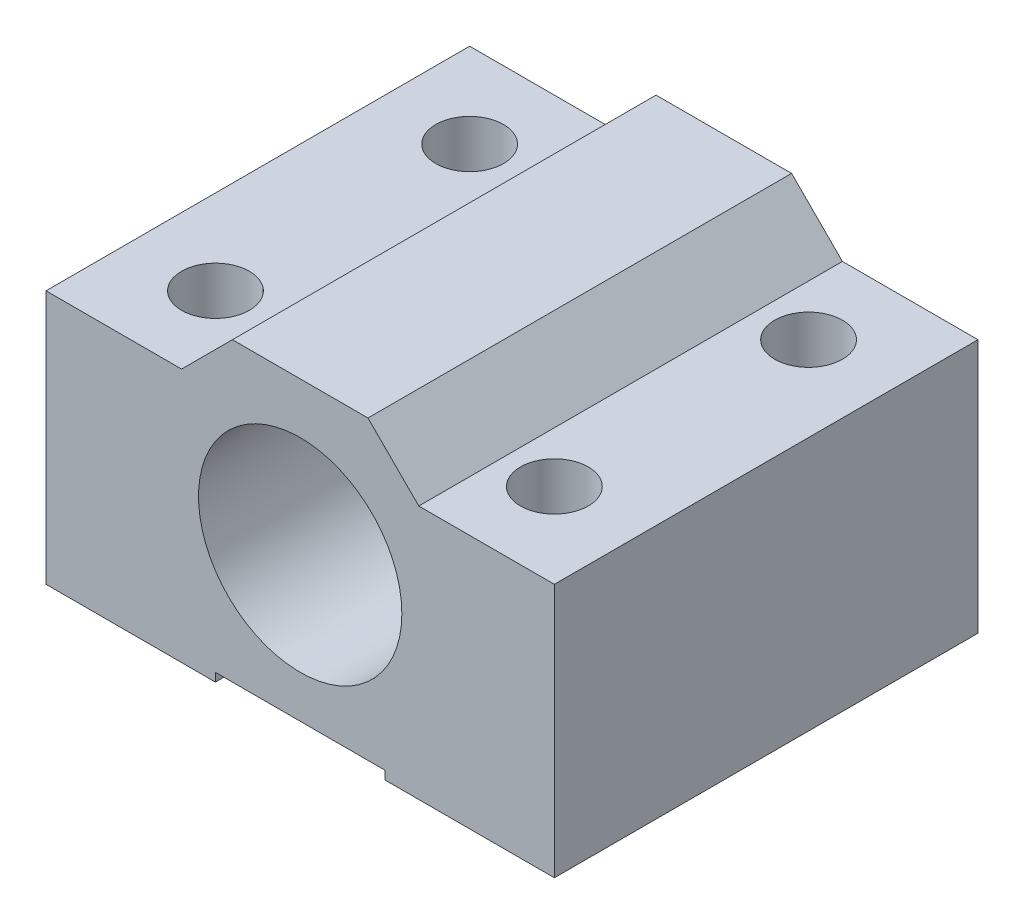
ISO-10303-21;
HEADER;
FILE_DESCRIPTION(('STEP AP214'),'2;1');
FILE_NAME('part.step','',(''),(''),'','','');
FILE_SCHEMA(('AUTOMOTIVE_DESIGN { 1 0 10303 214 1 1 1 1 }'));
ENDSEC;
DATA;
#1=APPLICATION_CONTEXT('core data for automotive mechanical design processes');
#2=APPLICATION_PROTOCOL_DEFINITION('international standard','automotive_design',2000,#1);
#3=PRODUCT_CONTEXT('',#1,'mechanical');
#4=PRODUCT('Part','Part','',(#3));
#5=PRODUCT_RELATED_PRODUCT_CATEGORY('part','',(#4));
#6=PRODUCT_DEFINITION_FORMATION('','',#4);
#7=PRODUCT_DEFINITION_CONTEXT('part definition',#1,'design');
#8=PRODUCT_DEFINITION('design','',#6,#7);
#9=PRODUCT_DEFINITION_SHAPE('','',#8);
#10=(LENGTH_UNIT() NAMED_UNIT(*) SI_UNIT(.MILLI.,.METRE.));
#11=(NAMED_UNIT(*) PLANE_ANGLE_UNIT() SI_UNIT($,.RADIAN.));
#12=(NAMED_UNIT(*) SI_UNIT($,.STERADIAN.) SOLID_ANGLE_UNIT());
#13=UNCERTAINTY_MEASURE_WITH_UNIT(LENGTH_MEASURE(1.E-05),#10,'distance_accuracy_value','');
#14=(GEOMETRIC_REPRESENTATION_CONTEXT(3) GLOBAL_UNCERTAINTY_ASSIGNED_CONTEXT((#13)) GLOBAL_UNIT_ASSIGNED_CONTEXT((#10,
#11,#12)) REPRESENTATION_CONTEXT('',''));
#15=CARTESIAN_POINT('',(0.,0.,0.));
#16=DIRECTION('',(0.,0.,1.));
#17=DIRECTION('',(1.,0.,0.));
#18=AXIS2_PLACEMENT_3D('',#15,#16,#17);
#19=CARTESIAN_POINT('',(15.,0.,25.));
#20=DIRECTION('',(0.,1.,0.));
#21=DIRECTION('',(0.,0.,1.));
#22=AXIS2_PLACEMENT_3D('',#19,#20,#21);
#23=PLANE('',#22);
#24=CARTESIAN_POINT('',(-10.,0.,5.));
#25=DIRECTION('',(0.,1.,0.));
#26=DIRECTION('',(-1.,0.,0.));
#27=AXIS2_PLACEMENT_3D('',#24,#25,#26);
#28=CIRCLE('',#27,2.);
#29=CARTESIAN_POINT('',(-12.,0.,5.));
#30=VERTEX_POINT('',#29);
#31=EDGE_CURVE('E222',#30,#30,#28,.T.);
#32=ORIENTED_EDGE('',*,*,#31,.T.);
#33=EDGE_LOOP('',(#32));
#34=FACE_BOUND('',#33,.T.);
#35=CARTESIAN_POINT('',(-10.,0.,20.));
#36=DIRECTION('',(0.,1.,0.));
#37=DIRECTION('',(1.,0.,0.));
#38=AXIS2_PLACEMENT_3D('',#35,#36,#37);
#39=CIRCLE('',#38,2.);
#40=CARTESIAN_POINT('',(-8.,0.,20.));
#41=VERTEX_POINT('',#40);
#42=EDGE_CURVE('E202',#41,#41,#39,.T.);
#43=ORIENTED_EDGE('',*,*,#42,.T.);
#44=EDGE_LOOP('',(#43));
#45=FACE_BOUND('',#44,.T.);
#46=DIRECTION('',(1.,0.,0.));
#47=VECTOR('',#46,1.);
#48=CARTESIAN_POINT('',(15.,0.,0.));
#49=LINE('',#48,#47);
#50=CARTESIAN_POINT('',(-15.,0.,0.));
#51=VERTEX_POINT('',#50);
#52=CARTESIAN_POINT('',(-5.,0.,0.));
#53=VERTEX_POINT('',#52);
#54=EDGE_CURVE('E152',#51,#53,#49,.T.);
#55=ORIENTED_EDGE('',*,*,#54,.T.);
#56=DIRECTION('',(0.,0.,-1.));
#57=VECTOR('',#56,1.);
#58=CARTESIAN_POINT('',(-5.,0.,25.));
#59=LINE('',#58,#57);
#60=CARTESIAN_POINT('',(-5.,0.,25.));
#61=VERTEX_POINT('',#60);
#62=EDGE_CURVE('E274',#61,#53,#59,.T.);
#63=ORIENTED_EDGE('',*,*,#62,.F.);
#64=DIRECTION('',(1.,0.,0.));
#65=VECTOR('',#64,1.);
#66=CARTESIAN_POINT('',(15.,0.,25.));
#67=LINE('',#66,#65);
#68=CARTESIAN_POINT('',(-15.,0.,25.));
#69=VERTEX_POINT('',#68);
#70=EDGE_CURVE('E179',#69,#61,#67,.T.);
#71=ORIENTED_EDGE('',*,*,#70,.F.);
#72=DIRECTION('',(0.,0.,-1.));
#73=VECTOR('',#72,1.);
#74=CARTESIAN_POINT('',(-15.,0.,25.));
#75=LINE('',#74,#73);
#76=EDGE_CURVE('E42',#69,#51,#75,.T.);
#77=ORIENTED_EDGE('',*,*,#76,.T.);
#78=EDGE_LOOP('',(#55,#63,#71,#77));
#79=FACE_BOUND('',#78,.T.);
#80=ADVANCED_FACE('F34',(#34,#45,#79),#23,.F.);
#81=CARTESIAN_POINT('',(-15.,15.,25.));
#82=DIRECTION('',(0.,-1.,0.));
#83=DIRECTION('',(1.,0.,0.));
#84=AXIS2_PLACEMENT_3D('',#81,#82,#83);
#85=PLANE('',#84);
#86=CARTESIAN_POINT('',(-10.,15.,20.));
#87=DIRECTION('',(0.,1.,0.));
#88=DIRECTION('',(1.,0.,0.));
#89=AXIS2_PLACEMENT_3D('',#86,#87,#88);
#90=CIRCLE('',#89,2.);
#91=CARTESIAN_POINT('',(-8.,15.,20.));
#92=VERTEX_POINT('',#91);
#93=EDGE_CURVE('E206',#92,#92,#90,.T.);
#94=ORIENTED_EDGE('',*,*,#93,.F.);
#95=EDGE_LOOP('',(#94));
#96=FACE_BOUND('',#95,.T.);
#97=CARTESIAN_POINT('',(-9.99999999999999,15.,5.));
#98=DIRECTION('',(0.,1.,0.));
#99=DIRECTION('',(-1.,0.,0.));
#100=AXIS2_PLACEMENT_3D('',#97,#98,#99);
#101=CIRCLE('',#100,2.);
#102=CARTESIAN_POINT('',(-12.,15.,5.));
#103=VERTEX_POINT('',#102);
#104=EDGE_CURVE('E219',#103,#103,#101,.T.);
#105=ORIENTED_EDGE('',*,*,#104,.F.);
#106=EDGE_LOOP('',(#105));
#107=FACE_BOUND('',#106,.T.);
#108=DIRECTION('',(-1.,0.,0.));
#109=VECTOR('',#108,1.);
#110=CARTESIAN_POINT('',(-15.,15.,0.));
#111=LINE('',#110,#109);
#112=CARTESIAN_POINT('',(-6.99999999999999,15.,0.));
#113=VERTEX_POINT('',#112);
#114=CARTESIAN_POINT('',(-15.,15.,0.));
#115=VERTEX_POINT('',#114);
#116=EDGE_CURVE('E145',#113,#115,#111,.T.);
#117=ORIENTED_EDGE('',*,*,#116,.T.);
#118=DIRECTION('',(0.,0.,-1.));
#119=VECTOR('',#118,1.);
#120=CARTESIAN_POINT('',(-15.,15.,25.));
#121=LINE('',#120,#119);
#122=CARTESIAN_POINT('',(-15.,15.,25.));
#123=VERTEX_POINT('',#122);
#124=EDGE_CURVE('E11',#123,#115,#121,.T.);
#125=ORIENTED_EDGE('',*,*,#124,.F.);
#126=DIRECTION('',(-1.,0.,0.));
#127=VECTOR('',#126,1.);
#128=CARTESIAN_POINT('',(-15.,15.,25.));
#129=LINE('',#128,#127);
#130=CARTESIAN_POINT('',(-6.99999999999999,15.,25.));
#131=VERTEX_POINT('',#130);
#132=EDGE_CURVE('E163',#131,#123,#129,.T.);
#133=ORIENTED_EDGE('',*,*,#132,.F.);
#134=DIRECTION('',(0.,0.,-1.));
#135=VECTOR('',#134,1.);
#136=CARTESIAN_POINT('',(-6.99999999999999,15.,25.));
#137=LINE('',#136,#135);
#138=EDGE_CURVE('E141',#131,#113,#137,.T.);
#139=ORIENTED_EDGE('',*,*,#138,.T.);
#140=EDGE_LOOP('',(#117,#125,#133,#139));
#141=FACE_BOUND('',#140,.T.);
#142=ADVANCED_FACE('F36',(#96,#107,#141),#85,.F.);
#143=CARTESIAN_POINT('',(-15.,0.,25.));
#144=DIRECTION('',(1.,0.,0.));
#145=DIRECTION('',(0.,0.,-1.));
#146=AXIS2_PLACEMENT_3D('',#143,#144,#145);
#147=PLANE('',#146);
#148=DIRECTION('',(0.,-1.,0.));
#149=VECTOR('',#148,1.);
#150=CARTESIAN_POINT('',(-15.,0.,0.));
#151=LINE('',#150,#149);
#152=EDGE_CURVE('E148',#115,#51,#151,.T.);
#153=ORIENTED_EDGE('',*,*,#152,.T.);
#154=ORIENTED_EDGE('',*,*,#76,.F.);
#155=DIRECTION('',(0.,-1.,0.));
#156=VECTOR('',#155,1.);
#157=CARTESIAN_POINT('',(-15.,0.,25.));
#158=LINE('',#157,#156);
#159=EDGE_CURVE('E99',#123,#69,#158,.T.);
#160=ORIENTED_EDGE('',*,*,#159,.F.);
#161=ORIENTED_EDGE('',*,*,#124,.T.);
#162=EDGE_LOOP('',(#153,#154,#160,#161));
#163=FACE_BOUND('',#162,.T.);
#164=ADVANCED_FACE('F299',(#163),#147,.F.);
#165=CARTESIAN_POINT('',(9.99999999999998,0.,20.));
#166=DIRECTION('',(0.,1.,0.));
#167=DIRECTION('',(-1.,0.,0.));
#168=AXIS2_PLACEMENT_3D('',#165,#166,#167);
#169=CIRCLE('',#168,2.);
#170=CARTESIAN_POINT('',(7.99999999999998,0.,20.));
#171=VERTEX_POINT('',#170);
#172=EDGE_CURVE('E210',#171,#171,#169,.T.);
#173=ORIENTED_EDGE('',*,*,#172,.T.);
#174=EDGE_LOOP('',(#173));
#175=FACE_BOUND('',#174,.T.);
#176=CARTESIAN_POINT('',(9.99999999999999,0.,5.));
#177=DIRECTION('',(0.,1.,0.));
#178=DIRECTION('',(1.,0.,0.));
#179=AXIS2_PLACEMENT_3D('',#176,#177,#178);
#180=CIRCLE('',#179,2.);
#181=CARTESIAN_POINT('',(12.,0.,5.));
#182=VERTEX_POINT('',#181);
#183=EDGE_CURVE('E216',#182,#182,#180,.T.);
#184=ORIENTED_EDGE('',*,*,#183,.T.);
#185=EDGE_LOOP('',(#184));
#186=FACE_BOUND('',#185,.T.);
#187=CARTESIAN_POINT('',(5.,0.,25.));
#188=VERTEX_POINT('',#187);
#189=CARTESIAN_POINT('',(15.,0.,25.));
#190=VERTEX_POINT('',#189);
#191=EDGE_CURVE('E234',#188,#190,#67,.T.);
#192=ORIENTED_EDGE('',*,*,#191,.F.);
#193=DIRECTION('',(0.,0.,1.));
#194=VECTOR('',#193,1.);
#195=CARTESIAN_POINT('',(5.,0.,25.));
#196=LINE('',#195,#194);
#197=CARTESIAN_POINT('',(5.,0.,0.));
#198=VERTEX_POINT('',#197);
#199=EDGE_CURVE('E263',#198,#188,#196,.T.);
#200=ORIENTED_EDGE('',*,*,#199,.F.);
#201=CARTESIAN_POINT('',(15.,0.,0.));
#202=VERTEX_POINT('',#201);
#203=EDGE_CURVE('E151',#198,#202,#49,.T.);
#204=ORIENTED_EDGE('',*,*,#203,.T.);
#205=DIRECTION('',(0.,0.,-1.));
#206=VECTOR('',#205,1.);
#207=CARTESIAN_POINT('',(15.,0.,25.));
#208=LINE('',#207,#206);
#209=EDGE_CURVE('E170',#190,#202,#208,.T.);
#210=ORIENTED_EDGE('',*,*,#209,.F.);
#211=EDGE_LOOP('',(#192,#200,#204,#210));
#212=FACE_BOUND('',#211,.T.);
#213=ADVANCED_FACE('F293',(#175,#186,#212),#23,.F.);
#214=CARTESIAN_POINT('',(15.,0.,25.));
#215=DIRECTION('',(-1.,0.,0.));
#216=DIRECTION('',(0.,0.,1.));
#217=AXIS2_PLACEMENT_3D('',#214,#215,#216);
#218=PLANE('',#217);
#219=DIRECTION('',(0.,1.,0.));
#220=VECTOR('',#219,1.);
#221=CARTESIAN_POINT('',(15.,0.,0.));
#222=LINE('',#221,#220);
#223=CARTESIAN_POINT('',(15.,15.,0.));
#224=VERTEX_POINT('',#223);
#225=EDGE_CURVE('E155',#202,#224,#222,.T.);
#226=ORIENTED_EDGE('',*,*,#225,.T.);
#227=DIRECTION('',(0.,0.,-1.));
#228=VECTOR('',#227,1.);
#229=CARTESIAN_POINT('',(15.,15.,25.));
#230=LINE('',#229,#228);
#231=CARTESIAN_POINT('',(15.,15.,25.));
#232=VERTEX_POINT('',#231);
#233=EDGE_CURVE('E167',#232,#224,#230,.T.);
#234=ORIENTED_EDGE('',*,*,#233,.F.);
#235=DIRECTION('',(0.,1.,0.));
#236=VECTOR('',#235,1.);
#237=CARTESIAN_POINT('',(15.,0.,25.));
#238=LINE('',#237,#236);
#239=EDGE_CURVE('E236',#190,#232,#238,.T.);
#240=ORIENTED_EDGE('',*,*,#239,.F.);
#241=ORIENTED_EDGE('',*,*,#209,.T.);
#242=EDGE_LOOP('',(#226,#234,#240,#241));
#243=FACE_BOUND('',#242,.T.);
#244=ADVANCED_FACE('F243',(#243),#218,.F.);
#245=CARTESIAN_POINT('',(15.,15.,25.));
#246=DIRECTION('',(0.,-1.,0.));
#247=DIRECTION('',(1.,0.,0.));
#248=AXIS2_PLACEMENT_3D('',#245,#246,#247);
#249=PLANE('',#248);
#250=CARTESIAN_POINT('',(9.99999999999998,15.,20.));
#251=DIRECTION('',(0.,1.,0.));
#252=DIRECTION('',(-1.,0.,0.));
#253=AXIS2_PLACEMENT_3D('',#250,#251,#252);
#254=CIRCLE('',#253,2.);
#255=CARTESIAN_POINT('',(7.99999999999999,15.,20.));
#256=VERTEX_POINT('',#255);
#257=EDGE_CURVE('E205',#256,#256,#254,.T.);
#258=ORIENTED_EDGE('',*,*,#257,.F.);
#259=EDGE_LOOP('',(#258));
#260=FACE_BOUND('',#259,.T.);
#261=CARTESIAN_POINT('',(10.,15.,5.));
#262=DIRECTION('',(0.,1.,0.));
#263=DIRECTION('',(1.,0.,0.));
#264=AXIS2_PLACEMENT_3D('',#261,#262,#263);
#265=CIRCLE('',#264,2.);
#266=CARTESIAN_POINT('',(12.,15.,5.));
#267=VERTEX_POINT('',#266);
#268=EDGE_CURVE('E213',#267,#267,#265,.T.);
#269=ORIENTED_EDGE('',*,*,#268,.F.);
#270=EDGE_LOOP('',(#269));
#271=FACE_BOUND('',#270,.T.);
#272=DIRECTION('',(-1.,0.,0.));
#273=VECTOR('',#272,1.);
#274=CARTESIAN_POINT('',(15.,15.,0.));
#275=LINE('',#274,#273);
#276=CARTESIAN_POINT('',(6.99999999999999,15.,0.));
#277=VERTEX_POINT('',#276);
#278=EDGE_CURVE('E157',#224,#277,#275,.T.);
#279=ORIENTED_EDGE('',*,*,#278,.T.);
#280=DIRECTION('',(0.,0.,-1.));
#281=VECTOR('',#280,1.);
#282=CARTESIAN_POINT('',(6.99999999999999,15.,25.));
#283=LINE('',#282,#281);
#284=CARTESIAN_POINT('',(6.99999999999999,15.,25.));
#285=VERTEX_POINT('',#284);
#286=EDGE_CURVE('E136',#285,#277,#283,.T.);
#287=ORIENTED_EDGE('',*,*,#286,.F.);
#288=DIRECTION('',(-1.,0.,0.));
#289=VECTOR('',#288,1.);
#290=CARTESIAN_POINT('',(15.,15.,25.));
#291=LINE('',#290,#289);
#292=EDGE_CURVE('E124',#232,#285,#291,.T.);
#293=ORIENTED_EDGE('',*,*,#292,.F.);
#294=ORIENTED_EDGE('',*,*,#233,.T.);
#295=EDGE_LOOP('',(#279,#287,#293,#294));
#296=FACE_BOUND('',#295,.T.);
#297=ADVANCED_FACE('F247',(#260,#271,#296),#249,.F.);
#298=CARTESIAN_POINT('',(6.99999999999999,15.,25.));
#299=DIRECTION('',(-0.707106781186549,-0.707106781186546,0.));
#300=DIRECTION('',(0.707106781186546,-0.707106781186549,0.));
#301=AXIS2_PLACEMENT_3D('',#298,#299,#300);
#302=PLANE('',#301);
#303=DIRECTION('',(-0.707106781186546,0.707106781186549,0.));
#304=VECTOR('',#303,1.);
#305=CARTESIAN_POINT('',(6.99999999999999,15.,0.));
#306=LINE('',#305,#304);
#307=CARTESIAN_POINT('',(4.,18.,0.));
#308=VERTEX_POINT('',#307);
#309=EDGE_CURVE('E133',#277,#308,#306,.T.);
#310=ORIENTED_EDGE('',*,*,#309,.T.);
#311=DIRECTION('',(0.,0.,-1.));
#312=VECTOR('',#311,1.);
#313=CARTESIAN_POINT('',(4.,18.,25.));
#314=LINE('',#313,#312);
#315=CARTESIAN_POINT('',(4.,18.,25.));
#316=VERTEX_POINT('',#315);
#317=EDGE_CURVE('E130',#316,#308,#314,.T.);
#318=ORIENTED_EDGE('',*,*,#317,.F.);
#319=DIRECTION('',(-0.707106781186546,0.707106781186549,0.));
#320=VECTOR('',#319,1.);
#321=CARTESIAN_POINT('',(6.99999999999999,15.,25.));
#322=LINE('',#321,#320);
#323=EDGE_CURVE('E115',#285,#316,#322,.T.);
#324=ORIENTED_EDGE('',*,*,#323,.F.);
#325=ORIENTED_EDGE('',*,*,#286,.T.);
#326=EDGE_LOOP('',(#310,#318,#324,#325));
#327=FACE_BOUND('',#326,.T.);
#328=ADVANCED_FACE('F131',(#327),#302,.F.);
#329=CARTESIAN_POINT('',(-4.,18.,25.));
#330=DIRECTION('',(0.,-1.,0.));
#331=DIRECTION('',(0.,0.,-1.));
#332=AXIS2_PLACEMENT_3D('',#329,#330,#331);
#333=PLANE('',#332);
#334=DIRECTION('',(-1.,0.,0.));
#335=VECTOR('',#334,1.);
#336=CARTESIAN_POINT('',(-4.,18.,0.));
#337=LINE('',#336,#335);
#338=CARTESIAN_POINT('',(-4.,18.,0.));
#339=VERTEX_POINT('',#338);
#340=EDGE_CURVE('E160',#308,#339,#337,.T.);
#341=ORIENTED_EDGE('',*,*,#340,.T.);
#342=DIRECTION('',(0.,0.,-1.));
#343=VECTOR('',#342,1.);
#344=CARTESIAN_POINT('',(-4.,18.,25.));
#345=LINE('',#344,#343);
#346=CARTESIAN_POINT('',(-4.,18.,25.));
#347=VERTEX_POINT('',#346);
#348=EDGE_CURVE('E137',#347,#339,#345,.T.);
#349=ORIENTED_EDGE('',*,*,#348,.F.);
#350=DIRECTION('',(-1.,0.,0.));
#351=VECTOR('',#350,1.);
#352=CARTESIAN_POINT('',(-4.,18.,25.));
#353=LINE('',#352,#351);
#354=EDGE_CURVE('E121',#316,#347,#353,.T.);
#355=ORIENTED_EDGE('',*,*,#354,.F.);
#356=ORIENTED_EDGE('',*,*,#317,.T.);
#357=EDGE_LOOP('',(#341,#349,#355,#356));
#358=FACE_BOUND('',#357,.T.);
#359=ADVANCED_FACE('F139',(#358),#333,.F.);
#360=CARTESIAN_POINT('',(-6.99999999999999,15.,25.));
#361=DIRECTION('',(0.707106781186549,-0.707106781186546,0.));
#362=DIRECTION('',(0.707106781186546,0.707106781186549,0.));
#363=AXIS2_PLACEMENT_3D('',#360,#361,#362);
#364=PLANE('',#363);
#365=DIRECTION('',(-0.707106781186546,-0.707106781186549,0.));
#366=VECTOR('',#365,1.);
#367=CARTESIAN_POINT('',(-6.99999999999999,15.,0.));
#368=LINE('',#367,#366);
#369=EDGE_CURVE('E91',#339,#113,#368,.T.);
#370=ORIENTED_EDGE('',*,*,#369,.T.);
#371=ORIENTED_EDGE('',*,*,#138,.F.);
#372=DIRECTION('',(-0.707106781186546,-0.707106781186549,0.));
#373=VECTOR('',#372,1.);
#374=CARTESIAN_POINT('',(-6.99999999999999,15.,25.));
#375=LINE('',#374,#373);
#376=EDGE_CURVE('E58',#347,#131,#375,.T.);
#377=ORIENTED_EDGE('',*,*,#376,.F.);
#378=ORIENTED_EDGE('',*,*,#348,.T.);
#379=EDGE_LOOP('',(#370,#371,#377,#378));
#380=FACE_BOUND('',#379,.T.);
#381=ADVANCED_FACE('F248',(#380),#364,.F.);
#382=CARTESIAN_POINT('',(0.,0.,25.));
#383=DIRECTION('',(0.,0.,1.));
#384=DIRECTION('',(1.,0.,0.));
#385=AXIS2_PLACEMENT_3D('',#382,#383,#384);
#386=PLANE('',#385);
#387=DIRECTION('',(0.,-1.,0.));
#388=VECTOR('',#387,1.);
#389=CARTESIAN_POINT('',(-5.,0.5,25.));
#390=LINE('',#389,#388);
#391=CARTESIAN_POINT('',(-5.,0.5,25.));
#392=VERTEX_POINT('',#391);
#393=EDGE_CURVE('E209',#392,#61,#390,.T.);
#394=ORIENTED_EDGE('',*,*,#393,.F.);
#395=DIRECTION('',(-1.,0.,0.));
#396=VECTOR('',#395,1.);
#397=CARTESIAN_POINT('',(-5.,0.5,25.));
#398=LINE('',#397,#396);
#399=CARTESIAN_POINT('',(5.,0.5,25.));
#400=VERTEX_POINT('',#399);
#401=EDGE_CURVE('E193',#400,#392,#398,.T.);
#402=ORIENTED_EDGE('',*,*,#401,.F.);
#403=DIRECTION('',(0.,-1.,0.));
#404=VECTOR('',#403,1.);
#405=CARTESIAN_POINT('',(5.,0.5,25.));
#406=LINE('',#405,#404);
#407=EDGE_CURVE('E196',#400,#188,#406,.T.);
#408=ORIENTED_EDGE('',*,*,#407,.T.);
#409=ORIENTED_EDGE('',*,*,#191,.T.);
#410=ORIENTED_EDGE('',*,*,#239,.T.);
#411=ORIENTED_EDGE('',*,*,#292,.T.);
#412=ORIENTED_EDGE('',*,*,#323,.T.);
#413=ORIENTED_EDGE('',*,*,#354,.T.);
#414=ORIENTED_EDGE('',*,*,#376,.T.);
#415=ORIENTED_EDGE('',*,*,#132,.T.);
#416=ORIENTED_EDGE('',*,*,#159,.T.);
#417=ORIENTED_EDGE('',*,*,#70,.T.);
#418=EDGE_LOOP('',(#394,#402,#408,#409,#410,#411,#412,#413,#414,#415,#416,#417));
#419=FACE_BOUND('',#418,.T.);
#420=CARTESIAN_POINT('',(0.,9.,25.));
#421=DIRECTION('',(0.,0.,1.));
#422=DIRECTION('',(1.,0.,0.));
#423=AXIS2_PLACEMENT_3D('',#420,#421,#422);
#424=CIRCLE('',#423,6.);
#425=CARTESIAN_POINT('',(6.,9.,25.));
#426=VERTEX_POINT('',#425);
#427=EDGE_CURVE('E225',#426,#426,#424,.T.);
#428=ORIENTED_EDGE('',*,*,#427,.F.);
#429=EDGE_LOOP('',(#428));
#430=FACE_BOUND('',#429,.T.);
#431=ADVANCED_FACE('F118',(#419,#430),#386,.T.);
#432=CARTESIAN_POINT('',(0.,0.,0.));
#433=DIRECTION('',(0.,0.,1.));
#434=DIRECTION('',(1.,0.,0.));
#435=AXIS2_PLACEMENT_3D('',#432,#433,#434);
#436=PLANE('',#435);
#437=CARTESIAN_POINT('',(0.,9.,0.));
#438=DIRECTION('',(0.,0.,1.));
#439=DIRECTION('',(1.,0.,0.));
#440=AXIS2_PLACEMENT_3D('',#437,#438,#439);
#441=CIRCLE('',#440,6.);
#442=CARTESIAN_POINT('',(6.,9.,0.));
#443=VERTEX_POINT('',#442);
#444=EDGE_CURVE('E149',#443,#443,#441,.T.);
#445=ORIENTED_EDGE('',*,*,#444,.T.);
#446=EDGE_LOOP('',(#445));
#447=FACE_BOUND('',#446,.T.);
#448=DIRECTION('',(1.,0.,0.));
#449=VECTOR('',#448,1.);
#450=CARTESIAN_POINT('',(-5.,0.5,0.));
#451=LINE('',#450,#449);
#452=CARTESIAN_POINT('',(-5.,0.5,0.));
#453=VERTEX_POINT('',#452);
#454=CARTESIAN_POINT('',(5.,0.5,0.));
#455=VERTEX_POINT('',#454);
#456=EDGE_CURVE('E187',#453,#455,#451,.T.);
#457=ORIENTED_EDGE('',*,*,#456,.F.);
#458=DIRECTION('',(0.,-1.,0.));
#459=VECTOR('',#458,1.);
#460=CARTESIAN_POINT('',(-5.,0.5,0.));
#461=LINE('',#460,#459);
#462=EDGE_CURVE('E185',#453,#53,#461,.T.);
#463=ORIENTED_EDGE('',*,*,#462,.T.);
#464=ORIENTED_EDGE('',*,*,#54,.F.);
#465=ORIENTED_EDGE('',*,*,#152,.F.);
#466=ORIENTED_EDGE('',*,*,#116,.F.);
#467=ORIENTED_EDGE('',*,*,#369,.F.);
#468=ORIENTED_EDGE('',*,*,#340,.F.);
#469=ORIENTED_EDGE('',*,*,#309,.F.);
#470=ORIENTED_EDGE('',*,*,#278,.F.);
#471=ORIENTED_EDGE('',*,*,#225,.F.);
#472=ORIENTED_EDGE('',*,*,#203,.F.);
#473=DIRECTION('',(0.,-1.,0.));
#474=VECTOR('',#473,1.);
#475=CARTESIAN_POINT('',(5.,0.5,0.));
#476=LINE('',#475,#474);
#477=EDGE_CURVE('E192',#455,#198,#476,.T.);
#478=ORIENTED_EDGE('',*,*,#477,.F.);
#479=EDGE_LOOP('',(#457,#463,#464,#465,#466,#467,#468,#469,#470,#471,#472,#478));
#480=FACE_BOUND('',#479,.T.);
#481=ADVANCED_FACE('F183',(#447,#480),#436,.F.);
#482=CARTESIAN_POINT('',(0.,9.,0.));
#483=DIRECTION('',(0.,0.,1.));
#484=DIRECTION('',(1.,0.,0.));
#485=AXIS2_PLACEMENT_3D('',#482,#483,#484);
#486=CYLINDRICAL_SURFACE('',#485,6.);
#487=ORIENTED_EDGE('',*,*,#444,.F.);
#488=EDGE_LOOP('',(#487));
#489=FACE_BOUND('',#488,.T.);
#490=ORIENTED_EDGE('',*,*,#427,.T.);
#491=EDGE_LOOP('',(#490));
#492=FACE_BOUND('',#491,.T.);
#493=ADVANCED_FACE('F337',(#489,#492),#486,.F.);
#494=CARTESIAN_POINT('',(-10.,0.,5.));
#495=DIRECTION('',(0.,1.,0.));
#496=DIRECTION('',(-1.,0.,0.));
#497=AXIS2_PLACEMENT_3D('',#494,#495,#496);
#498=CYLINDRICAL_SURFACE('',#497,2.);
#499=ORIENTED_EDGE('',*,*,#31,.F.);
#500=EDGE_LOOP('',(#499));
#501=FACE_BOUND('',#500,.T.);
#502=ORIENTED_EDGE('',*,*,#104,.T.);
#503=EDGE_LOOP('',(#502));
#504=FACE_BOUND('',#503,.T.);
#505=ADVANCED_FACE('F318',(#501,#504),#498,.F.);
#506=CARTESIAN_POINT('',(9.99999999999999,0.,5.));
#507=DIRECTION('',(0.,1.,0.));
#508=DIRECTION('',(-1.,0.,0.));
#509=AXIS2_PLACEMENT_3D('',#506,#507,#508);
#510=CYLINDRICAL_SURFACE('',#509,2.);
#511=ORIENTED_EDGE('',*,*,#183,.F.);
#512=EDGE_LOOP('',(#511));
#513=FACE_BOUND('',#512,.T.);
#514=ORIENTED_EDGE('',*,*,#268,.T.);
#515=EDGE_LOOP('',(#514));
#516=FACE_BOUND('',#515,.T.);
#517=ADVANCED_FACE('F315',(#513,#516),#510,.F.);
#518=CARTESIAN_POINT('',(9.99999999999998,0.,20.));
#519=DIRECTION('',(0.,1.,0.));
#520=DIRECTION('',(-1.,0.,0.));
#521=AXIS2_PLACEMENT_3D('',#518,#519,#520);
#522=CYLINDRICAL_SURFACE('',#521,2.);
#523=ORIENTED_EDGE('',*,*,#172,.F.);
#524=EDGE_LOOP('',(#523));
#525=FACE_BOUND('',#524,.T.);
#526=ORIENTED_EDGE('',*,*,#257,.T.);
#527=EDGE_LOOP('',(#526));
#528=FACE_BOUND('',#527,.T.);
#529=ADVANCED_FACE('F287',(#525,#528),#522,.F.);
#530=CARTESIAN_POINT('',(-10.,0.,20.));
#531=DIRECTION('',(0.,1.,0.));
#532=DIRECTION('',(-1.,0.,0.));
#533=AXIS2_PLACEMENT_3D('',#530,#531,#532);
#534=CYLINDRICAL_SURFACE('',#533,2.);
#535=ORIENTED_EDGE('',*,*,#42,.F.);
#536=EDGE_LOOP('',(#535));
#537=FACE_BOUND('',#536,.T.);
#538=ORIENTED_EDGE('',*,*,#93,.T.);
#539=EDGE_LOOP('',(#538));
#540=FACE_BOUND('',#539,.T.);
#541=ADVANCED_FACE('F279',(#537,#540),#534,.F.);
#542=CARTESIAN_POINT('',(-5.,0.5,25.));
#543=DIRECTION('',(-1.,0.,0.));
#544=DIRECTION('',(0.,0.,1.));
#545=AXIS2_PLACEMENT_3D('',#542,#543,#544);
#546=PLANE('',#545);
#547=ORIENTED_EDGE('',*,*,#62,.T.);
#548=ORIENTED_EDGE('',*,*,#462,.F.);
#549=DIRECTION('',(0.,0.,-1.));
#550=VECTOR('',#549,1.);
#551=CARTESIAN_POINT('',(-5.,0.5,25.));
#552=LINE('',#551,#550);
#553=EDGE_CURVE('E49',#392,#453,#552,.T.);
#554=ORIENTED_EDGE('',*,*,#553,.F.);
#555=ORIENTED_EDGE('',*,*,#393,.T.);
#556=EDGE_LOOP('',(#547,#548,#554,#555));
#557=FACE_BOUND('',#556,.T.);
#558=ADVANCED_FACE('F277',(#557),#546,.F.);
#559=CARTESIAN_POINT('',(5.,0.5,25.));
#560=DIRECTION('',(1.,0.,0.));
#561=DIRECTION('',(0.,0.,-1.));
#562=AXIS2_PLACEMENT_3D('',#559,#560,#561);
#563=PLANE('',#562);
#564=ORIENTED_EDGE('',*,*,#199,.T.);
#565=ORIENTED_EDGE('',*,*,#407,.F.);
#566=DIRECTION('',(0.,0.,1.));
#567=VECTOR('',#566,1.);
#568=CARTESIAN_POINT('',(5.,0.5,25.));
#569=LINE('',#568,#567);
#570=EDGE_CURVE('E198',#455,#400,#569,.T.);
#571=ORIENTED_EDGE('',*,*,#570,.F.);
#572=ORIENTED_EDGE('',*,*,#477,.T.);
#573=EDGE_LOOP('',(#564,#565,#571,#572));
#574=FACE_BOUND('',#573,.T.);
#575=ADVANCED_FACE('F268',(#574),#563,.F.);
#576=CARTESIAN_POINT('',(0.,0.5,0.));
#577=DIRECTION('',(0.,-1.,0.));
#578=DIRECTION('',(0.,0.,-1.));
#579=AXIS2_PLACEMENT_3D('',#576,#577,#578);
#580=PLANE('',#579);
#581=ORIENTED_EDGE('',*,*,#553,.T.);
#582=ORIENTED_EDGE('',*,*,#456,.T.);
#583=ORIENTED_EDGE('',*,*,#570,.T.);
#584=ORIENTED_EDGE('',*,*,#401,.T.);
#585=EDGE_LOOP('',(#581,#582,#583,#584));
#586=FACE_BOUND('',#585,.T.);
#587=ADVANCED_FACE('F269',(#586),#580,.T.);
#588=CLOSED_SHELL('',(#80,#142,#164,#213,#244,#297,#328,#359,#381,#431,#481,#493,#505,#517,#529,
#541,#558,#575,#587));
#589=MANIFOLD_SOLID_BREP('B2',#588);
#590=ADVANCED_BREP_SHAPE_REPRESENTATION('',(#18,#589),#14);
#591=SHAPE_DEFINITION_REPRESENTATION(#9,#590);
ENDSEC;
END-ISO-10303-21;
